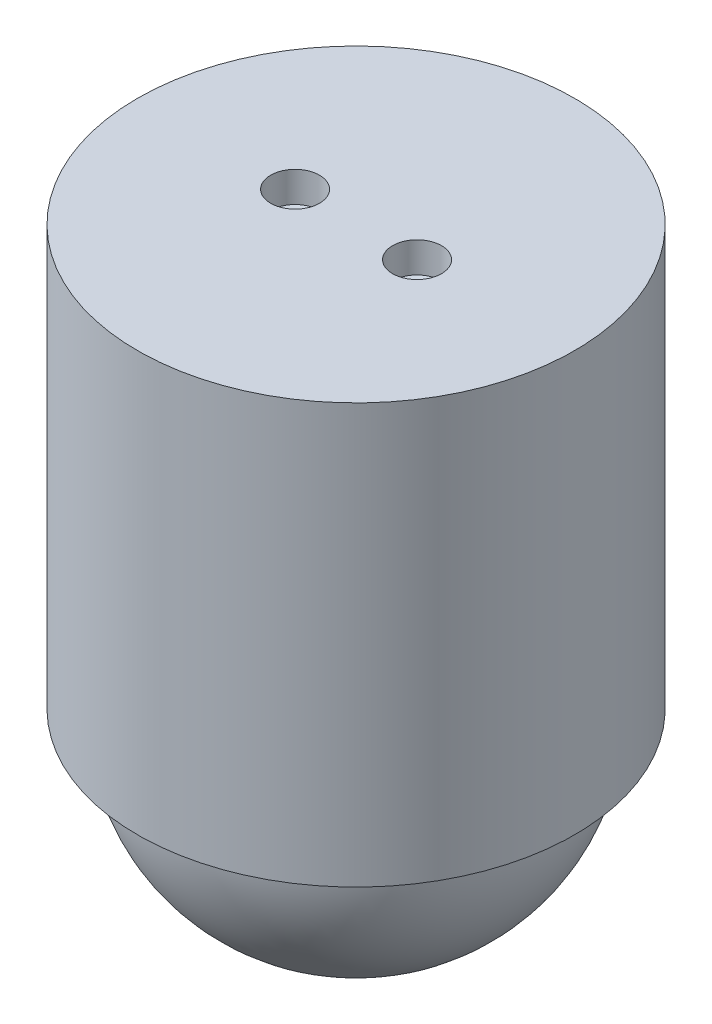
ISO-10303-21;
HEADER;
FILE_DESCRIPTION(('STEP AP214'),'2;1');
FILE_NAME('part.step','',(''),(''),'','','');
FILE_SCHEMA(('AUTOMOTIVE_DESIGN { 1 0 10303 214 1 1 1 1 }'));
ENDSEC;
DATA;
#1=APPLICATION_CONTEXT('core data for automotive mechanical design processes');
#2=APPLICATION_PROTOCOL_DEFINITION('international standard','automotive_design',2000,#1);
#3=PRODUCT_CONTEXT('',#1,'mechanical');
#4=PRODUCT('Part','Part','',(#3));
#5=PRODUCT_RELATED_PRODUCT_CATEGORY('part','',(#4));
#6=PRODUCT_DEFINITION_FORMATION('','',#4);
#7=PRODUCT_DEFINITION_CONTEXT('part definition',#1,'design');
#8=PRODUCT_DEFINITION('design','',#6,#7);
#9=PRODUCT_DEFINITION_SHAPE('','',#8);
#10=(LENGTH_UNIT() NAMED_UNIT(*) SI_UNIT(.MILLI.,.METRE.));
#11=(NAMED_UNIT(*) PLANE_ANGLE_UNIT() SI_UNIT($,.RADIAN.));
#12=(NAMED_UNIT(*) SI_UNIT($,.STERADIAN.) SOLID_ANGLE_UNIT());
#13=UNCERTAINTY_MEASURE_WITH_UNIT(LENGTH_MEASURE(1.E-05),#10,'distance_accuracy_value','');
#14=(GEOMETRIC_REPRESENTATION_CONTEXT(3) GLOBAL_UNCERTAINTY_ASSIGNED_CONTEXT((#13)) GLOBAL_UNIT_ASSIGNED_CONTEXT((#10,
#11,#12)) REPRESENTATION_CONTEXT('',''));
#15=CARTESIAN_POINT('',(0.,0.,0.));
#16=DIRECTION('',(0.,0.,1.));
#17=DIRECTION('',(1.,0.,0.));
#18=AXIS2_PLACEMENT_3D('',#15,#16,#17);
#19=CARTESIAN_POINT('',(0.,-20.955,0.));
#20=DIRECTION('',(0.,1.,0.));
#21=DIRECTION('',(-1.,0.,0.));
#22=AXIS2_PLACEMENT_3D('',#19,#20,#21);
#23=SPHERICAL_SURFACE('',#22,9.525);
#24=CARTESIAN_POINT('',(0.,-20.955,0.));
#25=DIRECTION('',(0.,1.,0.));
#26=DIRECTION('',(-1.,0.,0.));
#27=AXIS2_PLACEMENT_3D('',#24,#25,#26);
#28=CIRCLE('',#27,9.525);
#29=CARTESIAN_POINT('',(-9.525,-20.955,0.));
#30=VERTEX_POINT('',#29);
#31=EDGE_CURVE('E11',#30,#30,#28,.T.);
#32=ORIENTED_EDGE('',*,*,#31,.F.);
#33=EDGE_LOOP('',(#32));
#34=FACE_BOUND('',#33,.T.);
#35=ADVANCED_FACE('F34',(#34),#23,.T.);
#36=CARTESIAN_POINT('',(-10.922,-20.955,0.));
#37=DIRECTION('',(0.,-1.,0.));
#38=DIRECTION('',(1.,0.,0.));
#39=AXIS2_PLACEMENT_3D('',#36,#37,#38);
#40=PLANE('',#39);
#41=ORIENTED_EDGE('',*,*,#31,.T.);
#42=EDGE_LOOP('',(#41));
#43=FACE_BOUND('',#42,.T.);
#44=CARTESIAN_POINT('',(0.,-20.955,0.));
#45=DIRECTION('',(0.,1.,0.));
#46=DIRECTION('',(-1.,0.,0.));
#47=AXIS2_PLACEMENT_3D('',#44,#45,#46);
#48=CIRCLE('',#47,10.922);
#49=CARTESIAN_POINT('',(-10.922,-20.955,0.));
#50=VERTEX_POINT('',#49);
#51=EDGE_CURVE('E41',#50,#50,#48,.T.);
#52=ORIENTED_EDGE('',*,*,#51,.F.);
#53=EDGE_LOOP('',(#52));
#54=FACE_BOUND('',#53,.T.);
#55=ADVANCED_FACE('F76',(#43,#54),#40,.T.);
#56=CARTESIAN_POINT('',(0.,0.,0.));
#57=DIRECTION('',(0.,1.,0.));
#58=DIRECTION('',(-1.,0.,0.));
#59=AXIS2_PLACEMENT_3D('',#56,#57,#58);
#60=CYLINDRICAL_SURFACE('',#59,10.922);
#61=ORIENTED_EDGE('',*,*,#51,.T.);
#62=EDGE_LOOP('',(#61));
#63=FACE_BOUND('',#62,.T.);
#64=CARTESIAN_POINT('',(0.,0.,0.));
#65=DIRECTION('',(0.,1.,0.));
#66=DIRECTION('',(-1.,0.,0.));
#67=AXIS2_PLACEMENT_3D('',#64,#65,#66);
#68=CIRCLE('',#67,10.922);
#69=CARTESIAN_POINT('',(-10.922,0.,0.));
#70=VERTEX_POINT('',#69);
#71=EDGE_CURVE('E68',#70,#70,#68,.T.);
#72=ORIENTED_EDGE('',*,*,#71,.F.);
#73=EDGE_LOOP('',(#72));
#74=FACE_BOUND('',#73,.T.);
#75=ADVANCED_FACE('F73',(#63,#74),#60,.T.);
#76=CARTESIAN_POINT('',(0.,0.,0.));
#77=DIRECTION('',(0.,1.,0.));
#78=DIRECTION('',(-1.,0.,0.));
#79=AXIS2_PLACEMENT_3D('',#76,#77,#78);
#80=PLANE('',#79);
#81=CARTESIAN_POINT('',(3.048,0.,0.));
#82=DIRECTION('',(0.,1.,0.));
#83=DIRECTION('',(0.,0.,1.));
#84=AXIS2_PLACEMENT_3D('',#81,#82,#83);
#85=CIRCLE('',#84,1.2192);
#86=CARTESIAN_POINT('',(3.048,0.,1.2192));
#87=VERTEX_POINT('',#86);
#88=EDGE_CURVE('E58',#87,#87,#85,.T.);
#89=ORIENTED_EDGE('',*,*,#88,.F.);
#90=EDGE_LOOP('',(#89));
#91=FACE_BOUND('',#90,.T.);
#92=CARTESIAN_POINT('',(-3.048,0.,0.));
#93=DIRECTION('',(0.,1.,0.));
#94=DIRECTION('',(0.,0.,1.));
#95=AXIS2_PLACEMENT_3D('',#92,#93,#94);
#96=CIRCLE('',#95,1.2192);
#97=CARTESIAN_POINT('',(-3.048,0.,1.2192));
#98=VERTEX_POINT('',#97);
#99=EDGE_CURVE('E57',#98,#98,#96,.T.);
#100=ORIENTED_EDGE('',*,*,#99,.F.);
#101=EDGE_LOOP('',(#100));
#102=FACE_BOUND('',#101,.T.);
#103=ORIENTED_EDGE('',*,*,#71,.T.);
#104=EDGE_LOOP('',(#103));
#105=FACE_BOUND('',#104,.T.);
#106=ADVANCED_FACE('F83',(#91,#102,#105),#80,.T.);
#107=CARTESIAN_POINT('',(-3.048,-1.524,0.));
#108=DIRECTION('',(0.,1.,0.));
#109=DIRECTION('',(0.,0.,1.));
#110=AXIS2_PLACEMENT_3D('',#107,#108,#109);
#111=CONICAL_SURFACE('',#110,1.2192,1.02974425867665);
#112=CARTESIAN_POINT('',(-3.048,-2.2565692667184,0.));
#113=VERTEX_POINT('',#112);
#114=VERTEX_LOOP('',#113);
#115=FACE_BOUND('',#114,.T.);
#116=CARTESIAN_POINT('',(-3.048,-1.524,0.));
#117=DIRECTION('',(0.,1.,0.));
#118=DIRECTION('',(0.,0.,1.));
#119=AXIS2_PLACEMENT_3D('',#116,#117,#118);
#120=CIRCLE('',#119,1.2192);
#121=CARTESIAN_POINT('',(-3.048,-1.524,1.2192));
#122=VERTEX_POINT('',#121);
#123=EDGE_CURVE('E61',#122,#122,#120,.T.);
#124=ORIENTED_EDGE('',*,*,#123,.T.);
#125=EDGE_LOOP('',(#124));
#126=FACE_BOUND('',#125,.T.);
#127=ADVANCED_FACE('F89',(#115,#126),#111,.F.);
#128=CARTESIAN_POINT('',(-3.048,0.,0.));
#129=DIRECTION('',(0.,1.,0.));
#130=DIRECTION('',(0.,0.,1.));
#131=AXIS2_PLACEMENT_3D('',#128,#129,#130);
#132=CYLINDRICAL_SURFACE('',#131,1.2192);
#133=ORIENTED_EDGE('',*,*,#123,.F.);
#134=EDGE_LOOP('',(#133));
#135=FACE_BOUND('',#134,.T.);
#136=ORIENTED_EDGE('',*,*,#99,.T.);
#137=EDGE_LOOP('',(#136));
#138=FACE_BOUND('',#137,.T.);
#139=ADVANCED_FACE('F51',(#135,#138),#132,.F.);
#140=CARTESIAN_POINT('',(3.048,-1.524,0.));
#141=DIRECTION('',(0.,1.,0.));
#142=DIRECTION('',(0.,0.,1.));
#143=AXIS2_PLACEMENT_3D('',#140,#141,#142);
#144=CONICAL_SURFACE('',#143,1.2192,1.02974425867665);
#145=CARTESIAN_POINT('',(3.048,-2.2565692667184,0.));
#146=VERTEX_POINT('',#145);
#147=VERTEX_LOOP('',#146);
#148=FACE_BOUND('',#147,.T.);
#149=CARTESIAN_POINT('',(3.048,-1.524,0.));
#150=DIRECTION('',(0.,1.,0.));
#151=DIRECTION('',(0.,0.,1.));
#152=AXIS2_PLACEMENT_3D('',#149,#150,#151);
#153=CIRCLE('',#152,1.2192);
#154=CARTESIAN_POINT('',(3.048,-1.524,1.2192));
#155=VERTEX_POINT('',#154);
#156=EDGE_CURVE('E55',#155,#155,#153,.T.);
#157=ORIENTED_EDGE('',*,*,#156,.T.);
#158=EDGE_LOOP('',(#157));
#159=FACE_BOUND('',#158,.T.);
#160=ADVANCED_FACE('F47',(#148,#159),#144,.F.);
#161=CARTESIAN_POINT('',(3.048,0.,0.));
#162=DIRECTION('',(0.,1.,0.));
#163=DIRECTION('',(0.,0.,1.));
#164=AXIS2_PLACEMENT_3D('',#161,#162,#163);
#165=CYLINDRICAL_SURFACE('',#164,1.2192);
#166=ORIENTED_EDGE('',*,*,#156,.F.);
#167=EDGE_LOOP('',(#166));
#168=FACE_BOUND('',#167,.T.);
#169=ORIENTED_EDGE('',*,*,#88,.T.);
#170=EDGE_LOOP('',(#169));
#171=FACE_BOUND('',#170,.T.);
#172=ADVANCED_FACE('F50',(#168,#171),#165,.F.);
#173=CLOSED_SHELL('',(#35,#55,#75,#106,#127,#139,#160,#172));
#174=MANIFOLD_SOLID_BREP('B2',#173);
#175=ADVANCED_BREP_SHAPE_REPRESENTATION('',(#18,#174),#14);
#176=SHAPE_DEFINITION_REPRESENTATION(#9,#175);
ENDSEC;
END-ISO-10303-21;
